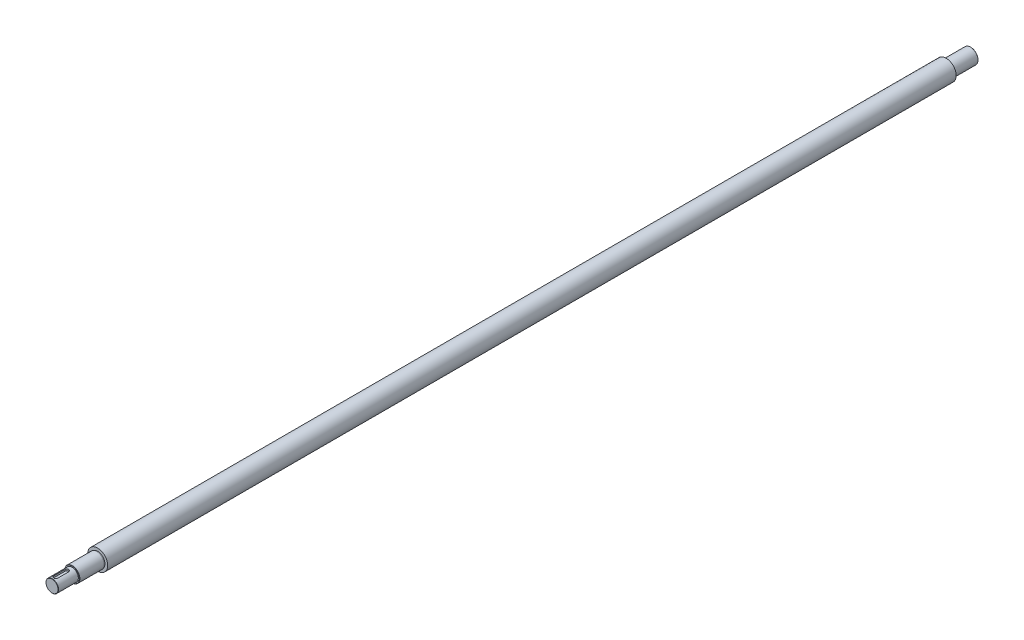
ISO-10303-21;
HEADER;
FILE_DESCRIPTION(('STEP AP214'),'2;1');
FILE_NAME('part.step','',(''),(''),'','','');
FILE_SCHEMA(('AUTOMOTIVE_DESIGN { 1 0 10303 214 1 1 1 1 }'));
ENDSEC;
DATA;
#1=APPLICATION_CONTEXT('core data for automotive mechanical design processes');
#2=APPLICATION_PROTOCOL_DEFINITION('international standard','automotive_design',2000,#1);
#3=PRODUCT_CONTEXT('',#1,'mechanical');
#4=PRODUCT('Part','Part','',(#3));
#5=PRODUCT_RELATED_PRODUCT_CATEGORY('part','',(#4));
#6=PRODUCT_DEFINITION_FORMATION('','',#4);
#7=PRODUCT_DEFINITION_CONTEXT('part definition',#1,'design');
#8=PRODUCT_DEFINITION('design','',#6,#7);
#9=PRODUCT_DEFINITION_SHAPE('','',#8);
#10=(LENGTH_UNIT() NAMED_UNIT(*) SI_UNIT(.MILLI.,.METRE.));
#11=(NAMED_UNIT(*) PLANE_ANGLE_UNIT() SI_UNIT($,.RADIAN.));
#12=(NAMED_UNIT(*) SI_UNIT($,.STERADIAN.) SOLID_ANGLE_UNIT());
#13=UNCERTAINTY_MEASURE_WITH_UNIT(LENGTH_MEASURE(1.E-05),#10,'distance_accuracy_value','');
#14=(GEOMETRIC_REPRESENTATION_CONTEXT(3) GLOBAL_UNCERTAINTY_ASSIGNED_CONTEXT((#13)) GLOBAL_UNIT_ASSIGNED_CONTEXT((#10,
#11,#12)) REPRESENTATION_CONTEXT('',''));
#15=CARTESIAN_POINT('',(0.,0.,0.));
#16=DIRECTION('',(0.,0.,1.));
#17=DIRECTION('',(1.,0.,0.));
#18=AXIS2_PLACEMENT_3D('',#15,#16,#17);
#19=CARTESIAN_POINT('',(0.,0.,40.));
#20=DIRECTION('',(0.,0.,-1.));
#21=DIRECTION('',(-1.,0.,0.));
#22=AXIS2_PLACEMENT_3D('',#19,#20,#21);
#23=CYLINDRICAL_SURFACE('',#22,12.5);
#24=DIRECTION('',(0.,0.,-1.));
#25=VECTOR('',#24,1.);
#26=CARTESIAN_POINT('',(-4.,11.842719282327,40.));
#27=LINE('',#26,#25);
#28=CARTESIAN_POINT('',(-4.,11.842719282327,33.));
#29=VERTEX_POINT('',#28);
#30=CARTESIAN_POINT('',(-4.,11.842719282327,11.));
#31=VERTEX_POINT('',#30);
#32=EDGE_CURVE('E72',#29,#31,#27,.T.);
#33=ORIENTED_EDGE('',*,*,#32,.T.);
#34=CARTESIAN_POINT('',(-4.,11.842719282327,11.));
#35=CARTESIAN_POINT('',(-4.00001410484613,11.8427027366058,10.8906002280384));
#36=CARTESIAN_POINT('',(-3.995512175201,11.8442348052368,10.7812097901521));
#37=CARTESIAN_POINT('',(-3.97758606678449,11.8502730910574,10.5632717592635));
#38=CARTESIAN_POINT('',(-3.96416412872571,11.8547785613244,10.4547239615155));
#39=CARTESIAN_POINT('',(-3.92855725119429,11.8666242076309,10.2395389691545));
#40=CARTESIAN_POINT('',(-3.9063967602145,11.8739564736691,10.1328973043888));
#41=CARTESIAN_POINT('',(-3.85353581488656,11.8912164993788,9.92199436162844));
#42=CARTESIAN_POINT('',(-3.82283508754056,11.90114434202,9.81773315984322));
#43=CARTESIAN_POINT('',(-3.71831764495512,11.9343840843196,9.50969499572164));
#44=CARTESIAN_POINT('',(-3.63203544139887,11.9611699822066,9.31036344793197));
#45=CARTESIAN_POINT('',(-3.42895021192288,12.0209583955878,8.92898744295816));
#46=CARTESIAN_POINT('',(-3.31213030924909,12.0539643457894,8.74695262095034));
#47=CARTESIAN_POINT('',(-3.0467850788479,12.123798407807,8.39874601140078));
#48=CARTESIAN_POINT('',(-2.89735303896514,12.1607158548651,8.23328167566053));
#49=CARTESIAN_POINT('',(-2.57296449846116,12.2334561140966,7.92928515141109));
#50=CARTESIAN_POINT('',(-2.39800356343232,12.2692787347869,7.79075765164231));
#51=CARTESIAN_POINT('',(-2.02237003010512,12.3368244653945,7.54138480162945));
#52=CARTESIAN_POINT('',(-1.82118394546976,12.3684294972003,7.43127804353036));
#53=CARTESIAN_POINT('',(-1.40197197350368,12.4229251649937,7.24675050465061));
#54=CARTESIAN_POINT('',(-1.18395091903581,12.4458182908278,7.1723195262181));
#55=CARTESIAN_POINT('',(-0.744713961063363,12.4796767811416,7.0636411357495));
#56=CARTESIAN_POINT('',(-0.523827920101153,12.4910030499338,7.02817506661988));
#57=CARTESIAN_POINT('',(-0.0789648151746365,12.5017287122873,6.99456720095836));
#58=CARTESIAN_POINT('',(0.145011564197643,12.5011307063103,6.99641726647516));
#59=CARTESIAN_POINT('',(0.581094974437692,12.4883236673358,7.03659882927133));
#60=CARTESIAN_POINT('',(0.793338226675238,12.4765355800409,7.07360776797881));
#61=CARTESIAN_POINT('',(1.2084232001272,12.443194578958,7.18088055160631));
#62=CARTESIAN_POINT('',(1.41126440871778,12.4216411334261,7.2511462074328));
#63=CARTESIAN_POINT('',(1.80478548808183,12.3706364987475,7.42375784223576));
#64=CARTESIAN_POINT('',(1.99528012693527,12.3410893067347,7.52649651986879));
#65=CARTESIAN_POINT('',(2.35673113106229,12.2771965403044,7.76082904904521));
#66=CARTESIAN_POINT('',(2.5276825327575,12.2428497517893,7.89243020640299));
#67=CARTESIAN_POINT('',(2.85304511528221,12.1712409097156,8.18744653129155));
#68=CARTESIAN_POINT('',(3.00641313381737,12.1339170352569,8.3519967025921));
#69=CARTESIAN_POINT('',(3.28377291775701,12.0618172896256,8.7049719000853));
#70=CARTESIAN_POINT('',(3.40775562728565,12.0270422062066,8.89340425883215));
#71=CARTESIAN_POINT('',(3.56958208232607,11.9796198433082,9.19137123774859));
#72=CARTESIAN_POINT('',(3.61975674493765,11.9645161845072,9.29399905924154));
#73=CARTESIAN_POINT('',(3.71123075156255,11.9364591580623,9.5034047527517));
#74=CARTESIAN_POINT('',(3.75253376401034,11.9235049021446,9.61018088778642));
#75=CARTESIAN_POINT('',(3.82585831579178,11.9001802342949,9.82701332789164));
#76=CARTESIAN_POINT('',(3.85788979915529,11.889807055759,9.93706597797312));
#77=CARTESIAN_POINT('',(3.91241790563964,11.8719756673203,10.1596951569476));
#78=CARTESIAN_POINT('',(3.93491889994975,11.8645161211931,10.2722705037974));
#79=CARTESIAN_POINT('',(3.96832908530803,11.8533815888388,10.487239245861));
#80=CARTESIAN_POINT('',(3.9802038456482,11.8493925948395,10.5894674157946));
#81=CARTESIAN_POINT('',(3.99603937127681,11.8440568016292,10.7944610780333));
#82=CARTESIAN_POINT('',(4.00001099551563,11.8427063770563,10.8972256382805));
#83=CARTESIAN_POINT('',(4.,11.842719282327,11.));
#84=B_SPLINE_CURVE_WITH_KNOTS('',3,(#34,#35,#36,#37,#38,#39,#40,#41,#42,#43,#44,#45,#46,#47,#48,
#49,#50,#51,#52,#53,#54,#55,#56,#57,#58,#59,#60,#61,#62,#63,#64,#65,#66,#67,#68,#69,#70,#71,#72,
#73,#74,#75,#76,#77,#78,#79,#80,#81,#82,#83),.UNSPECIFIED.,.F.,.F.,(4,2,2,2,2,2,2,2,2,2,2,2,2,2,
2,2,2,2,2,2,2,2,2,2,4),(0.,0.328080176984104,0.656077971124948,0.983164539368217,1.310261564488,
1.96355293984248,2.61720612481382,3.29209427898756,3.96709980211697,4.65819584662373,
5.34909422856993,6.01770820975085,6.68617638029994,7.3304550155383,7.97476873730064,
8.6271932010581,9.27978300073407,9.96076419384897,10.6419549776068,10.9872862883783,
11.3324745283028,11.6772911585126,12.0219494657669,12.3305938648259,12.6388138912331),.UNSPECIFIED.);
#85=CARTESIAN_POINT('',(4.,11.842719282327,11.));
#86=VERTEX_POINT('',#85);
#87=EDGE_CURVE('E159',#31,#86,#84,.T.);
#88=ORIENTED_EDGE('',*,*,#87,.T.);
#89=DIRECTION('',(0.,0.,-1.));
#90=VECTOR('',#89,1.);
#91=CARTESIAN_POINT('',(4.,11.842719282327,40.));
#92=LINE('',#91,#90);
#93=CARTESIAN_POINT('',(4.,11.842719282327,33.));
#94=VERTEX_POINT('',#93);
#95=EDGE_CURVE('E222',#86,#94,#92,.F.);
#96=ORIENTED_EDGE('',*,*,#95,.T.);
#97=CARTESIAN_POINT('',(4.,11.842719282327,33.));
#98=CARTESIAN_POINT('',(4.00001410484613,11.8427027366058,33.1093997719616));
#99=CARTESIAN_POINT('',(3.995512175201,11.8442348052368,33.2187902098479));
#100=CARTESIAN_POINT('',(3.97758606678449,11.8502730910574,33.4367282407365));
#101=CARTESIAN_POINT('',(3.96416412872571,11.8547785613244,33.5452760384845));
#102=CARTESIAN_POINT('',(3.92855725119429,11.8666242076309,33.7604610308455));
#103=CARTESIAN_POINT('',(3.9063967602145,11.8739564736691,33.8671026956112));
#104=CARTESIAN_POINT('',(3.85353581488656,11.8912164993788,34.0780056383716));
#105=CARTESIAN_POINT('',(3.82283508754056,11.90114434202,34.1822668401568));
#106=CARTESIAN_POINT('',(3.71831764495512,11.9343840843196,34.4903050042784));
#107=CARTESIAN_POINT('',(3.63203544139887,11.9611699822066,34.689636552068));
#108=CARTESIAN_POINT('',(3.42895021192288,12.0209583955878,35.0710125570418));
#109=CARTESIAN_POINT('',(3.31213030924909,12.0539643457894,35.2530473790497));
#110=CARTESIAN_POINT('',(3.0467850788479,12.123798407807,35.6012539885992));
#111=CARTESIAN_POINT('',(2.89735303896514,12.1607158548651,35.7667183243395));
#112=CARTESIAN_POINT('',(2.57296449846116,12.2334561140966,36.0707148485889));
#113=CARTESIAN_POINT('',(2.39800356343232,12.2692787347869,36.2092423483577));
#114=CARTESIAN_POINT('',(2.02237003010512,12.3368244653945,36.4586151983706));
#115=CARTESIAN_POINT('',(1.82118394546976,12.3684294972003,36.5687219564696));
#116=CARTESIAN_POINT('',(1.40197197350368,12.4229251649937,36.7532494953494));
#117=CARTESIAN_POINT('',(1.18395091903581,12.4458182908278,36.8276804737819));
#118=CARTESIAN_POINT('',(0.744713961063362,12.4796767811416,36.9363588642505));
#119=CARTESIAN_POINT('',(0.523827920101153,12.4910030499338,36.9718249333801));
#120=CARTESIAN_POINT('',(0.0789648151746358,12.5017287122873,37.0054327990416));
#121=CARTESIAN_POINT('',(-0.145011564197643,12.5011307063103,37.0035827335248));
#122=CARTESIAN_POINT('',(-0.581094974437693,12.4883236673358,36.9634011707287));
#123=CARTESIAN_POINT('',(-0.793338226675239,12.4765355800409,36.9263922320212));
#124=CARTESIAN_POINT('',(-1.20842320012721,12.443194578958,36.8191194483937));
#125=CARTESIAN_POINT('',(-1.41126440871778,12.4216411334261,36.7488537925672));
#126=CARTESIAN_POINT('',(-1.80478548808183,12.3706364987475,36.5762421577642));
#127=CARTESIAN_POINT('',(-1.99528012693527,12.3410893067347,36.4735034801312));
#128=CARTESIAN_POINT('',(-2.35673113106229,12.2771965403044,36.2391709509548));
#129=CARTESIAN_POINT('',(-2.5276825327575,12.2428497517893,36.107569793597));
#130=CARTESIAN_POINT('',(-2.85304511528221,12.1712409097156,35.8125534687084));
#131=CARTESIAN_POINT('',(-3.00641313381738,12.1339170352569,35.6480032974079));
#132=CARTESIAN_POINT('',(-3.28377291775701,12.0618172896256,35.2950280999147));
#133=CARTESIAN_POINT('',(-3.40775562728565,12.0270422062066,35.1065957411678));
#134=CARTESIAN_POINT('',(-3.56958208232607,11.9796198433082,34.8086287622514));
#135=CARTESIAN_POINT('',(-3.61975674493765,11.9645161845072,34.7060009407585));
#136=CARTESIAN_POINT('',(-3.71123075156255,11.9364591580623,34.4965952472483));
#137=CARTESIAN_POINT('',(-3.75253376401034,11.9235049021446,34.3898191122136));
#138=CARTESIAN_POINT('',(-3.82585831579178,11.9001802342949,34.1729866721084));
#139=CARTESIAN_POINT('',(-3.85788979915528,11.889807055759,34.0629340220269));
#140=CARTESIAN_POINT('',(-3.91241790563964,11.8719756673203,33.8403048430524));
#141=CARTESIAN_POINT('',(-3.93491889994975,11.8645161211931,33.7277294962026));
#142=CARTESIAN_POINT('',(-3.96832908530803,11.8533815888388,33.512760754139));
#143=CARTESIAN_POINT('',(-3.9802038456482,11.8493925948395,33.4105325842054));
#144=CARTESIAN_POINT('',(-3.99603937127681,11.8440568016292,33.2055389219667));
#145=CARTESIAN_POINT('',(-4.00001099551563,11.8427063770563,33.1027743617195));
#146=CARTESIAN_POINT('',(-4.,11.842719282327,33.));
#147=B_SPLINE_CURVE_WITH_KNOTS('',3,(#97,#98,#99,#100,#101,#102,#103,#104,#105,#106,#107,#108,
#109,#110,#111,#112,#113,#114,#115,#116,#117,#118,#119,#120,#121,#122,#123,#124,#125,#126,#127,
#128,#129,#130,#131,#132,#133,#134,#135,#136,#137,#138,#139,#140,#141,#142,#143,#144,#145,#146),
.UNSPECIFIED.,.F.,.F.,(4,2,2,2,2,2,2,2,2,2,2,2,2,2,2,2,2,2,2,2,2,2,2,2,4),(0.,0.328080176984104,
0.656077971124949,0.98316453936822,1.310261564488,1.96355293984248,2.61720612481382,
3.29209427898756,3.96709980211697,4.65819584662373,5.34909422856993,6.01770820975086,
6.68617638029994,7.3304550155383,7.97476873730065,8.6271932010581,9.27978300073407,
9.96076419384898,10.6419549776068,10.9872862883783,11.3324745283028,11.6772911585126,
12.0219494657669,12.3305938648259,12.6388138912331),.UNSPECIFIED.);
#148=EDGE_CURVE('E64',#94,#29,#147,.T.);
#149=ORIENTED_EDGE('',*,*,#148,.T.);
#150=EDGE_LOOP('',(#33,#88,#96,#149));
#151=FACE_BOUND('',#150,.T.);
#152=CARTESIAN_POINT('',(0.,0.,39.5));
#153=DIRECTION('',(0.,0.,1.));
#154=DIRECTION('',(1.,0.,0.));
#155=AXIS2_PLACEMENT_3D('',#152,#153,#154);
#156=CIRCLE('',#155,12.5);
#157=CARTESIAN_POINT('',(12.5,0.,39.5));
#158=VERTEX_POINT('',#157);
#159=EDGE_CURVE('E147',#158,#158,#156,.F.);
#160=ORIENTED_EDGE('',*,*,#159,.T.);
#161=EDGE_LOOP('',(#160));
#162=FACE_BOUND('',#161,.T.);
#163=CARTESIAN_POINT('',(0.,0.,0.));
#164=DIRECTION('',(0.,0.,1.));
#165=DIRECTION('',(1.,0.,0.));
#166=AXIS2_PLACEMENT_3D('',#163,#164,#165);
#167=CIRCLE('',#166,12.5);
#168=CARTESIAN_POINT('',(12.5,0.,0.));
#169=VERTEX_POINT('',#168);
#170=EDGE_CURVE('E139',#169,#169,#167,.T.);
#171=ORIENTED_EDGE('',*,*,#170,.T.);
#172=EDGE_LOOP('',(#171));
#173=FACE_BOUND('',#172,.T.);
#174=ADVANCED_FACE('F47',(#151,#162,#173),#23,.T.);
#175=CARTESIAN_POINT('',(0.,0.,40.));
#176=DIRECTION('',(0.,0.,1.));
#177=DIRECTION('',(1.,0.,0.));
#178=AXIS2_PLACEMENT_3D('',#175,#176,#177);
#179=PLANE('',#178);
#180=CARTESIAN_POINT('',(0.,0.,40.));
#181=DIRECTION('',(0.,0.,1.));
#182=DIRECTION('',(1.,0.,0.));
#183=AXIS2_PLACEMENT_3D('',#180,#181,#182);
#184=CIRCLE('',#183,12.);
#185=CARTESIAN_POINT('',(12.,0.,40.));
#186=VERTEX_POINT('',#185);
#187=EDGE_CURVE('E143',#186,#186,#184,.T.);
#188=ORIENTED_EDGE('',*,*,#187,.T.);
#189=EDGE_LOOP('',(#188));
#190=FACE_BOUND('',#189,.T.);
#191=ADVANCED_FACE('F203',(#190),#179,.T.);
#192=CARTESIAN_POINT('',(0.,0.,40.));
#193=DIRECTION('',(0.,0.,-1.));
#194=DIRECTION('',(-1.,0.,0.));
#195=AXIS2_PLACEMENT_3D('',#192,#193,#194);
#196=CONICAL_SURFACE('',#195,12.,0.785398163397445);
#197=ORIENTED_EDGE('',*,*,#159,.F.);
#198=EDGE_LOOP('',(#197));
#199=FACE_BOUND('',#198,.T.);
#200=ORIENTED_EDGE('',*,*,#187,.F.);
#201=EDGE_LOOP('',(#200));
#202=FACE_BOUND('',#201,.T.);
#203=ADVANCED_FACE('F201',(#199,#202),#196,.T.);
#204=CARTESIAN_POINT('',(0.,0.,-49.));
#205=DIRECTION('',(0.,0.,1.));
#206=DIRECTION('',(1.,0.,0.));
#207=AXIS2_PLACEMENT_3D('',#204,#205,#206);
#208=CYLINDRICAL_SURFACE('',#207,15.);
#209=CARTESIAN_POINT('',(0.,0.,-0.499999999999994));
#210=DIRECTION('',(0.,0.,-1.));
#211=DIRECTION('',(-1.,0.,0.));
#212=AXIS2_PLACEMENT_3D('',#209,#210,#211);
#213=CIRCLE('',#212,15.);
#214=CARTESIAN_POINT('',(-15.,0.,-0.499999999999994));
#215=VERTEX_POINT('',#214);
#216=EDGE_CURVE('E151',#215,#215,#213,.T.);
#217=ORIENTED_EDGE('',*,*,#216,.T.);
#218=EDGE_LOOP('',(#217));
#219=FACE_BOUND('',#218,.T.);
#220=CARTESIAN_POINT('',(0.,0.,-49.));
#221=DIRECTION('',(0.,0.,-1.));
#222=DIRECTION('',(-1.,0.,0.));
#223=AXIS2_PLACEMENT_3D('',#220,#221,#222);
#224=CIRCLE('',#223,15.);
#225=CARTESIAN_POINT('',(-15.,0.,-49.));
#226=VERTEX_POINT('',#225);
#227=EDGE_CURVE('E130',#226,#226,#224,.T.);
#228=ORIENTED_EDGE('',*,*,#227,.F.);
#229=EDGE_LOOP('',(#228));
#230=FACE_BOUND('',#229,.T.);
#231=ADVANCED_FACE('F195',(#219,#230),#208,.T.);
#232=CARTESIAN_POINT('',(0.,0.,-49.));
#233=DIRECTION('',(0.,0.,-1.));
#234=DIRECTION('',(-1.,0.,0.));
#235=AXIS2_PLACEMENT_3D('',#232,#233,#234);
#236=PLANE('',#235);
#237=CARTESIAN_POINT('',(0.,0.,-49.));
#238=DIRECTION('',(0.,0.,-1.));
#239=DIRECTION('',(-1.,0.,0.));
#240=AXIS2_PLACEMENT_3D('',#237,#238,#239);
#241=CIRCLE('',#240,14.5);
#242=CARTESIAN_POINT('',(-14.5,0.,-49.));
#243=VERTEX_POINT('',#242);
#244=EDGE_CURVE('E121',#243,#243,#241,.T.);
#245=ORIENTED_EDGE('',*,*,#244,.F.);
#246=EDGE_LOOP('',(#245));
#247=FACE_BOUND('',#246,.T.);
#248=ORIENTED_EDGE('',*,*,#227,.T.);
#249=EDGE_LOOP('',(#248));
#250=FACE_BOUND('',#249,.T.);
#251=ADVANCED_FACE('F191',(#247,#250),#236,.T.);
#252=CARTESIAN_POINT('',(0.,0.,0.));
#253=DIRECTION('',(0.,0.,-1.));
#254=DIRECTION('',(-1.,0.,0.));
#255=AXIS2_PLACEMENT_3D('',#252,#253,#254);
#256=PLANE('',#255);
#257=CARTESIAN_POINT('',(0.,0.,0.));
#258=DIRECTION('',(0.,0.,-1.));
#259=DIRECTION('',(-1.,0.,0.));
#260=AXIS2_PLACEMENT_3D('',#257,#258,#259);
#261=CIRCLE('',#260,14.5);
#262=CARTESIAN_POINT('',(-14.5,0.,0.));
#263=VERTEX_POINT('',#262);
#264=EDGE_CURVE('E155',#263,#263,#261,.F.);
#265=ORIENTED_EDGE('',*,*,#264,.T.);
#266=EDGE_LOOP('',(#265));
#267=FACE_BOUND('',#266,.T.);
#268=ORIENTED_EDGE('',*,*,#170,.F.);
#269=EDGE_LOOP('',(#268));
#270=FACE_BOUND('',#269,.T.);
#271=ADVANCED_FACE('F194',(#267,#270),#256,.F.);
#272=CARTESIAN_POINT('',(0.,0.,-0.499999999999994));
#273=DIRECTION('',(0.,0.,-1.));
#274=DIRECTION('',(-1.,0.,0.));
#275=AXIS2_PLACEMENT_3D('',#272,#273,#274);
#276=CONICAL_SURFACE('',#275,15.,0.785398163397453);
#277=ORIENTED_EDGE('',*,*,#264,.F.);
#278=EDGE_LOOP('',(#277));
#279=FACE_BOUND('',#278,.T.);
#280=ORIENTED_EDGE('',*,*,#216,.F.);
#281=EDGE_LOOP('',(#280));
#282=FACE_BOUND('',#281,.T.);
#283=ADVANCED_FACE('F190',(#279,#282),#276,.T.);
#284=CARTESIAN_POINT('',(0.,8.5,33.));
#285=DIRECTION('',(0.,1.,0.));
#286=DIRECTION('',(0.,0.,1.));
#287=AXIS2_PLACEMENT_3D('',#284,#285,#286);
#288=CYLINDRICAL_SURFACE('',#287,4.);
#289=DIRECTION('',(0.,1.,0.));
#290=VECTOR('',#289,1.);
#291=CARTESIAN_POINT('',(4.,8.5,33.));
#292=LINE('',#291,#290);
#293=CARTESIAN_POINT('',(4.,8.5,33.));
#294=VERTEX_POINT('',#293);
#295=EDGE_CURVE('E89',#294,#94,#292,.T.);
#296=ORIENTED_EDGE('',*,*,#295,.F.);
#297=CARTESIAN_POINT('',(0.,8.5,33.));
#298=DIRECTION('',(0.,1.,0.));
#299=DIRECTION('',(0.,0.,1.));
#300=AXIS2_PLACEMENT_3D('',#297,#298,#299);
#301=CIRCLE('',#300,4.);
#302=CARTESIAN_POINT('',(-4.,8.5,33.));
#303=VERTEX_POINT('',#302);
#304=EDGE_CURVE('E93',#303,#294,#301,.T.);
#305=ORIENTED_EDGE('',*,*,#304,.F.);
#306=DIRECTION('',(0.,1.,0.));
#307=VECTOR('',#306,1.);
#308=CARTESIAN_POINT('',(-4.,8.5,33.));
#309=LINE('',#308,#307);
#310=EDGE_CURVE('E127',#303,#29,#309,.T.);
#311=ORIENTED_EDGE('',*,*,#310,.T.);
#312=ORIENTED_EDGE('',*,*,#148,.F.);
#313=EDGE_LOOP('',(#296,#305,#311,#312));
#314=FACE_BOUND('',#313,.T.);
#315=ADVANCED_FACE('F91',(#314),#288,.F.);
#316=CARTESIAN_POINT('',(-4.,8.5,33.));
#317=DIRECTION('',(-1.,0.,0.));
#318=DIRECTION('',(0.,0.,1.));
#319=AXIS2_PLACEMENT_3D('',#316,#317,#318);
#320=PLANE('',#319);
#321=ORIENTED_EDGE('',*,*,#310,.F.);
#322=DIRECTION('',(0.,0.,1.));
#323=VECTOR('',#322,1.);
#324=CARTESIAN_POINT('',(-4.,8.5,33.));
#325=LINE('',#324,#323);
#326=CARTESIAN_POINT('',(-4.,8.5,11.));
#327=VERTEX_POINT('',#326);
#328=EDGE_CURVE('E99',#327,#303,#325,.T.);
#329=ORIENTED_EDGE('',*,*,#328,.F.);
#330=DIRECTION('',(0.,1.,0.));
#331=VECTOR('',#330,1.);
#332=CARTESIAN_POINT('',(-4.,8.5,11.));
#333=LINE('',#332,#331);
#334=EDGE_CURVE('E131',#327,#31,#333,.T.);
#335=ORIENTED_EDGE('',*,*,#334,.T.);
#336=ORIENTED_EDGE('',*,*,#32,.F.);
#337=EDGE_LOOP('',(#321,#329,#335,#336));
#338=FACE_BOUND('',#337,.T.);
#339=ADVANCED_FACE('F183',(#338),#320,.F.);
#340=CARTESIAN_POINT('',(0.,8.5,11.));
#341=DIRECTION('',(0.,1.,0.));
#342=DIRECTION('',(0.,0.,1.));
#343=AXIS2_PLACEMENT_3D('',#340,#341,#342);
#344=CYLINDRICAL_SURFACE('',#343,4.);
#345=ORIENTED_EDGE('',*,*,#334,.F.);
#346=CARTESIAN_POINT('',(0.,8.5,11.));
#347=DIRECTION('',(0.,1.,0.));
#348=DIRECTION('',(0.,0.,1.));
#349=AXIS2_PLACEMENT_3D('',#346,#347,#348);
#350=CIRCLE('',#349,4.);
#351=CARTESIAN_POINT('',(4.,8.5,11.));
#352=VERTEX_POINT('',#351);
#353=EDGE_CURVE('E109',#352,#327,#350,.T.);
#354=ORIENTED_EDGE('',*,*,#353,.F.);
#355=DIRECTION('',(0.,1.,0.));
#356=VECTOR('',#355,1.);
#357=CARTESIAN_POINT('',(4.,8.5,11.));
#358=LINE('',#357,#356);
#359=EDGE_CURVE('E98',#352,#86,#358,.T.);
#360=ORIENTED_EDGE('',*,*,#359,.T.);
#361=ORIENTED_EDGE('',*,*,#87,.F.);
#362=EDGE_LOOP('',(#345,#354,#360,#361));
#363=FACE_BOUND('',#362,.T.);
#364=ADVANCED_FACE('F178',(#363),#344,.F.);
#365=CARTESIAN_POINT('',(4.,8.5,33.));
#366=DIRECTION('',(1.,0.,0.));
#367=DIRECTION('',(0.,0.,-1.));
#368=AXIS2_PLACEMENT_3D('',#365,#366,#367);
#369=PLANE('',#368);
#370=ORIENTED_EDGE('',*,*,#359,.F.);
#371=DIRECTION('',(0.,0.,-1.));
#372=VECTOR('',#371,1.);
#373=CARTESIAN_POINT('',(4.,8.5,33.));
#374=LINE('',#373,#372);
#375=EDGE_CURVE('E102',#294,#352,#374,.T.);
#376=ORIENTED_EDGE('',*,*,#375,.F.);
#377=ORIENTED_EDGE('',*,*,#295,.T.);
#378=ORIENTED_EDGE('',*,*,#95,.F.);
#379=EDGE_LOOP('',(#370,#376,#377,#378));
#380=FACE_BOUND('',#379,.T.);
#381=ADVANCED_FACE('F103',(#380),#369,.F.);
#382=CARTESIAN_POINT('',(0.,8.5,33.));
#383=DIRECTION('',(0.,1.,0.));
#384=DIRECTION('',(0.,0.,1.));
#385=AXIS2_PLACEMENT_3D('',#382,#383,#384);
#386=PLANE('',#385);
#387=ORIENTED_EDGE('',*,*,#304,.T.);
#388=ORIENTED_EDGE('',*,*,#375,.T.);
#389=ORIENTED_EDGE('',*,*,#353,.T.);
#390=ORIENTED_EDGE('',*,*,#328,.T.);
#391=EDGE_LOOP('',(#387,#388,#389,#390));
#392=FACE_BOUND('',#391,.T.);
#393=ADVANCED_FACE('F111',(#392),#386,.T.);
#394=CARTESIAN_POINT('',(0.,0.,-51.));
#395=DIRECTION('',(0.,0.,1.));
#396=DIRECTION('',(1.,0.,0.));
#397=AXIS2_PLACEMENT_3D('',#394,#395,#396);
#398=CYLINDRICAL_SURFACE('',#397,14.5);
#399=CARTESIAN_POINT('',(0.,0.,-51.));
#400=DIRECTION('',(0.,0.,-1.));
#401=DIRECTION('',(-1.,0.,0.));
#402=AXIS2_PLACEMENT_3D('',#399,#400,#401);
#403=CIRCLE('',#402,14.5);
#404=CARTESIAN_POINT('',(-14.5,0.,-51.));
#405=VERTEX_POINT('',#404);
#406=EDGE_CURVE('E114',#405,#405,#403,.T.);
#407=ORIENTED_EDGE('',*,*,#406,.F.);
#408=EDGE_LOOP('',(#407));
#409=FACE_BOUND('',#408,.T.);
#410=ORIENTED_EDGE('',*,*,#244,.T.);
#411=EDGE_LOOP('',(#410));
#412=FACE_BOUND('',#411,.T.);
#413=ADVANCED_FACE('F289',(#409,#412),#398,.T.);
#414=CARTESIAN_POINT('',(0.,0.,-1742.));
#415=DIRECTION('',(0.,0.,1.));
#416=DIRECTION('',(1.,0.,0.));
#417=AXIS2_PLACEMENT_3D('',#414,#415,#416);
#418=CYLINDRICAL_SURFACE('',#417,20.);
#419=CARTESIAN_POINT('',(0.,0.,-1742.));
#420=DIRECTION('',(0.,0.,-1.));
#421=DIRECTION('',(-1.,0.,0.));
#422=AXIS2_PLACEMENT_3D('',#419,#420,#421);
#423=CIRCLE('',#422,20.);
#424=CARTESIAN_POINT('',(20.,0.,-1742.));
#425=VERTEX_POINT('',#424);
#426=EDGE_CURVE('E118',#425,#425,#423,.T.);
#427=CARTESIAN_POINT('',(0.,0.,-51.));
#428=DIRECTION('',(0.,0.,-1.));
#429=DIRECTION('',(-1.,0.,0.));
#430=AXIS2_PLACEMENT_3D('',#427,#428,#429);
#431=CIRCLE('',#430,20.);
#432=CARTESIAN_POINT('',(20.,0.,-50.9999999999999));
#433=VERTEX_POINT('',#432);
#434=EDGE_CURVE('E244',#433,#433,#431,.T.);
#435=CARTESIAN_POINT('',(20.,0.,-1742.));
#436=CARTESIAN_POINT('',(20.,0.,-1724.38541666667));
#437=CARTESIAN_POINT('',(20.,0.,-1706.77083333333));
#438=CARTESIAN_POINT('',(20.,0.,-1671.54166666667));
#439=CARTESIAN_POINT('',(20.,0.,-1653.92708333333));
#440=CARTESIAN_POINT('',(20.,0.,-1618.69791666667));
#441=CARTESIAN_POINT('',(20.,0.,-1601.08333333333));
#442=CARTESIAN_POINT('',(20.,0.,-1565.85416666667));
#443=CARTESIAN_POINT('',(20.,0.,-1548.23958333333));
#444=CARTESIAN_POINT('',(20.,0.,-1513.01041666667));
#445=CARTESIAN_POINT('',(20.,0.,-1495.39583333333));
#446=CARTESIAN_POINT('',(20.,0.,-1460.16666666667));
#447=CARTESIAN_POINT('',(20.,0.,-1442.55208333333));
#448=CARTESIAN_POINT('',(20.,0.,-1407.32291666667));
#449=CARTESIAN_POINT('',(20.,0.,-1389.70833333333));
#450=CARTESIAN_POINT('',(20.,0.,-1354.47916666667));
#451=CARTESIAN_POINT('',(20.,0.,-1336.86458333333));
#452=CARTESIAN_POINT('',(20.,0.,-1301.63541666667));
#453=CARTESIAN_POINT('',(20.,0.,-1284.02083333333));
#454=CARTESIAN_POINT('',(20.,0.,-1248.79166666667));
#455=CARTESIAN_POINT('',(20.,0.,-1231.17708333333));
#456=CARTESIAN_POINT('',(20.,0.,-1195.94791666667));
#457=CARTESIAN_POINT('',(20.,0.,-1178.33333333333));
#458=CARTESIAN_POINT('',(20.,0.,-1143.10416666667));
#459=CARTESIAN_POINT('',(20.,0.,-1125.48958333333));
#460=CARTESIAN_POINT('',(20.,0.,-1090.26041666667));
#461=CARTESIAN_POINT('',(20.,0.,-1072.64583333333));
#462=CARTESIAN_POINT('',(20.,0.,-1037.41666666667));
#463=CARTESIAN_POINT('',(20.,0.,-1019.80208333333));
#464=CARTESIAN_POINT('',(20.,0.,-984.572916666667));
#465=CARTESIAN_POINT('',(20.,0.,-966.958333333333));
#466=CARTESIAN_POINT('',(20.,0.,-931.729166666667));
#467=CARTESIAN_POINT('',(20.,0.,-914.114583333333));
#468=CARTESIAN_POINT('',(20.,0.,-878.885416666667));
#469=CARTESIAN_POINT('',(20.,0.,-861.270833333333));
#470=CARTESIAN_POINT('',(20.,0.,-826.041666666667));
#471=CARTESIAN_POINT('',(20.,0.,-808.427083333333));
#472=CARTESIAN_POINT('',(20.,0.,-773.197916666667));
#473=CARTESIAN_POINT('',(20.,0.,-755.583333333333));
#474=CARTESIAN_POINT('',(20.,0.,-720.354166666667));
#475=CARTESIAN_POINT('',(20.,0.,-702.739583333333));
#476=CARTESIAN_POINT('',(20.,0.,-667.510416666667));
#477=CARTESIAN_POINT('',(20.,0.,-649.895833333333));
#478=CARTESIAN_POINT('',(20.,0.,-614.666666666667));
#479=CARTESIAN_POINT('',(20.,0.,-597.052083333333));
#480=CARTESIAN_POINT('',(20.,0.,-561.822916666667));
#481=CARTESIAN_POINT('',(20.,0.,-544.208333333333));
#482=CARTESIAN_POINT('',(20.,0.,-508.979166666667));
#483=CARTESIAN_POINT('',(20.,0.,-491.364583333333));
#484=CARTESIAN_POINT('',(20.,0.,-456.135416666667));
#485=CARTESIAN_POINT('',(20.,0.,-438.520833333333));
#486=CARTESIAN_POINT('',(20.,0.,-403.291666666667));
#487=CARTESIAN_POINT('',(20.,0.,-385.677083333333));
#488=CARTESIAN_POINT('',(20.,0.,-350.447916666667));
#489=CARTESIAN_POINT('',(20.,0.,-332.833333333333));
#490=CARTESIAN_POINT('',(20.,0.,-297.604166666667));
#491=CARTESIAN_POINT('',(20.,0.,-279.989583333333));
#492=CARTESIAN_POINT('',(20.,0.,-244.760416666667));
#493=CARTESIAN_POINT('',(20.,0.,-227.145833333333));
#494=CARTESIAN_POINT('',(20.,0.,-191.916666666667));
#495=CARTESIAN_POINT('',(20.,0.,-174.302083333333));
#496=CARTESIAN_POINT('',(20.,0.,-139.072916666667));
#497=CARTESIAN_POINT('',(20.,0.,-121.458333333333));
#498=CARTESIAN_POINT('',(20.,0.,-86.2291666666667));
#499=CARTESIAN_POINT('',(20.,0.,-68.6145833333333));
#500=CARTESIAN_POINT('',(20.,0.,-50.9999999999999));
#501=B_SPLINE_CURVE_WITH_KNOTS('',3,(#435,#436,#437,#438,#439,#440,#441,#442,#443,#444,#445,
#446,#447,#448,#449,#450,#451,#452,#453,#454,#455,#456,#457,#458,#459,#460,#461,#462,#463,#464,
#465,#466,#467,#468,#469,#470,#471,#472,#473,#474,#475,#476,#477,#478,#479,#480,#481,#482,#483,
#484,#485,#486,#487,#488,#489,#490,#491,#492,#493,#494,#495,#496,#497,#498,#499,#500),
.UNSPECIFIED.,.F.,.F.,(4,2,2,2,2,2,2,2,2,2,2,2,2,2,2,2,2,2,2,2,2,2,2,2,2,2,2,2,2,2,2,2,4),(0.,
52.8437499999999,105.6875,158.53125,211.375,264.21875,317.0625,369.90625,422.75,475.59375,
528.4375,581.28125,634.125,686.96875,739.8125,792.65625,845.5,898.34375,951.1875,1004.03125,
1056.875,1109.71875,1162.5625,1215.40625,1268.25,1321.09375,1373.9375,1426.78125,1479.625,
1532.46875,1585.3125,1638.15625,1691.),.UNSPECIFIED.);
#502=EDGE_CURVE('BSEAM282',#425,#433,#501,.T.);
#503=ORIENTED_EDGE('',*,*,#426,.F.);
#504=ORIENTED_EDGE('',*,*,#434,.T.);
#505=ORIENTED_EDGE('',*,*,#502,.T.);
#506=ORIENTED_EDGE('',*,*,#502,.F.);
#507=EDGE_LOOP('',(#503,#505,#504,#506));
#508=FACE_BOUND('',#507,.T.);
#509=ADVANCED_FACE('F282',(#508),#418,.T.);
#510=CARTESIAN_POINT('',(0.,0.,-1742.));
#511=DIRECTION('',(0.,0.,-1.));
#512=DIRECTION('',(-1.,0.,0.));
#513=AXIS2_PLACEMENT_3D('',#510,#511,#512);
#514=PLANE('',#513);
#515=CARTESIAN_POINT('',(0.,0.,-1742.));
#516=DIRECTION('',(0.,0.,-1.));
#517=DIRECTION('',(-1.,0.,0.));
#518=AXIS2_PLACEMENT_3D('',#515,#516,#517);
#519=CIRCLE('',#518,14.5);
#520=CARTESIAN_POINT('',(-14.5,0.,-1742.));
#521=VERTEX_POINT('',#520);
#522=EDGE_CURVE('E227',#521,#521,#519,.T.);
#523=ORIENTED_EDGE('',*,*,#522,.F.);
#524=EDGE_LOOP('',(#523));
#525=FACE_BOUND('',#524,.T.);
#526=ORIENTED_EDGE('',*,*,#426,.T.);
#527=EDGE_LOOP('',(#526));
#528=FACE_BOUND('',#527,.T.);
#529=ADVANCED_FACE('F279',(#525,#528),#514,.T.);
#530=CARTESIAN_POINT('',(0.,0.,-51.));
#531=DIRECTION('',(0.,0.,-1.));
#532=DIRECTION('',(-1.,0.,0.));
#533=AXIS2_PLACEMENT_3D('',#530,#531,#532);
#534=PLANE('',#533);
#535=ORIENTED_EDGE('',*,*,#406,.T.);
#536=EDGE_LOOP('',(#535));
#537=FACE_BOUND('',#536,.T.);
#538=ORIENTED_EDGE('',*,*,#434,.F.);
#539=EDGE_LOOP('',(#538));
#540=FACE_BOUND('',#539,.T.);
#541=ADVANCED_FACE('F277',(#537,#540),#534,.F.);
#542=CARTESIAN_POINT('',(0.,0.,-1744.));
#543=DIRECTION('',(0.,0.,1.));
#544=DIRECTION('',(1.,0.,0.));
#545=AXIS2_PLACEMENT_3D('',#542,#543,#544);
#546=CYLINDRICAL_SURFACE('',#545,14.5);
#547=CARTESIAN_POINT('',(0.,0.,-1744.));
#548=DIRECTION('',(0.,0.,-1.));
#549=DIRECTION('',(-1.,0.,0.));
#550=AXIS2_PLACEMENT_3D('',#547,#548,#549);
#551=CIRCLE('',#550,14.5);
#552=CARTESIAN_POINT('',(-14.5,0.,-1744.));
#553=VERTEX_POINT('',#552);
#554=EDGE_CURVE('E239',#553,#553,#551,.T.);
#555=ORIENTED_EDGE('',*,*,#554,.F.);
#556=EDGE_LOOP('',(#555));
#557=FACE_BOUND('',#556,.T.);
#558=ORIENTED_EDGE('',*,*,#522,.T.);
#559=EDGE_LOOP('',(#558));
#560=FACE_BOUND('',#559,.T.);
#561=ADVANCED_FACE('F273',(#557,#560),#546,.T.);
#562=CARTESIAN_POINT('',(0.,0.,-1791.));
#563=DIRECTION('',(0.,0.,1.));
#564=DIRECTION('',(1.,0.,0.));
#565=AXIS2_PLACEMENT_3D('',#562,#563,#564);
#566=CYLINDRICAL_SURFACE('',#565,15.);
#567=CARTESIAN_POINT('',(0.,0.,-1790.5));
#568=DIRECTION('',(0.,0.,-1.));
#569=DIRECTION('',(-1.,0.,0.));
#570=AXIS2_PLACEMENT_3D('',#567,#568,#569);
#571=CIRCLE('',#570,15.);
#572=CARTESIAN_POINT('',(-15.,0.,-1790.5));
#573=VERTEX_POINT('',#572);
#574=EDGE_CURVE('E11',#573,#573,#571,.F.);
#575=ORIENTED_EDGE('',*,*,#574,.T.);
#576=EDGE_LOOP('',(#575));
#577=FACE_BOUND('',#576,.T.);
#578=CARTESIAN_POINT('',(0.,0.,-1744.));
#579=DIRECTION('',(0.,0.,-1.));
#580=DIRECTION('',(-1.,0.,0.));
#581=AXIS2_PLACEMENT_3D('',#578,#579,#580);
#582=CIRCLE('',#581,15.);
#583=CARTESIAN_POINT('',(-15.,0.,-1744.));
#584=VERTEX_POINT('',#583);
#585=EDGE_CURVE('E251',#584,#584,#582,.T.);
#586=ORIENTED_EDGE('',*,*,#585,.T.);
#587=EDGE_LOOP('',(#586));
#588=FACE_BOUND('',#587,.T.);
#589=ADVANCED_FACE('F258',(#577,#588),#566,.T.);
#590=CARTESIAN_POINT('',(0.,0.,-1791.));
#591=DIRECTION('',(0.,0.,-1.));
#592=DIRECTION('',(-1.,0.,0.));
#593=AXIS2_PLACEMENT_3D('',#590,#591,#592);
#594=PLANE('',#593);
#595=CARTESIAN_POINT('',(0.,0.,-1791.));
#596=DIRECTION('',(0.,0.,-1.));
#597=DIRECTION('',(-1.,0.,0.));
#598=AXIS2_PLACEMENT_3D('',#595,#596,#597);
#599=CIRCLE('',#598,14.5);
#600=CARTESIAN_POINT('',(-14.5,0.,-1791.));
#601=VERTEX_POINT('',#600);
#602=EDGE_CURVE('E57',#601,#601,#599,.T.);
#603=ORIENTED_EDGE('',*,*,#602,.T.);
#604=EDGE_LOOP('',(#603));
#605=FACE_BOUND('',#604,.T.);
#606=ADVANCED_FACE('F262',(#605),#594,.T.);
#607=CARTESIAN_POINT('',(0.,0.,-1744.));
#608=DIRECTION('',(0.,0.,-1.));
#609=DIRECTION('',(-1.,0.,0.));
#610=AXIS2_PLACEMENT_3D('',#607,#608,#609);
#611=PLANE('',#610);
#612=ORIENTED_EDGE('',*,*,#554,.T.);
#613=EDGE_LOOP('',(#612));
#614=FACE_BOUND('',#613,.T.);
#615=ORIENTED_EDGE('',*,*,#585,.F.);
#616=EDGE_LOOP('',(#615));
#617=FACE_BOUND('',#616,.T.);
#618=ADVANCED_FACE('F260',(#614,#617),#611,.F.);
#619=CARTESIAN_POINT('',(0.,0.,-1791.));
#620=DIRECTION('',(0.,0.,1.));
#621=DIRECTION('',(1.,0.,0.));
#622=AXIS2_PLACEMENT_3D('',#619,#620,#621);
#623=CONICAL_SURFACE('',#622,14.5,0.785398163397325);
#624=ORIENTED_EDGE('',*,*,#574,.F.);
#625=EDGE_LOOP('',(#624));
#626=FACE_BOUND('',#625,.T.);
#627=ORIENTED_EDGE('',*,*,#602,.F.);
#628=EDGE_LOOP('',(#627));
#629=FACE_BOUND('',#628,.T.);
#630=ADVANCED_FACE('F50',(#626,#629),#623,.T.);
#631=CLOSED_SHELL('',(#174,#191,#203,#231,#251,#271,#283,#315,#339,#364,#381,#393,#413,#509,
#529,#541,#561,#589,#606,#618,#630));
#632=MANIFOLD_SOLID_BREP('B2',#631);
#633=ADVANCED_BREP_SHAPE_REPRESENTATION('',(#18,#632),#14);
#634=SHAPE_DEFINITION_REPRESENTATION(#9,#633);
ENDSEC;
END-ISO-10303-21;
